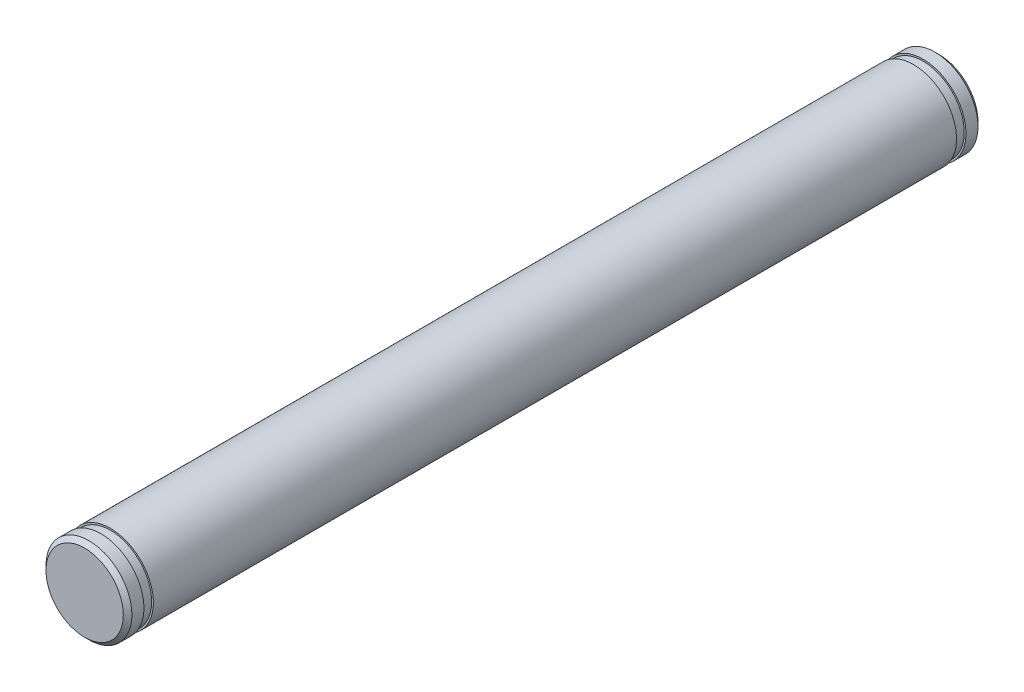
ISO-10303-21;
HEADER;
FILE_DESCRIPTION(('STEP AP214'),'2;1');
FILE_NAME('part.step','',(''),(''),'','','');
FILE_SCHEMA(('AUTOMOTIVE_DESIGN { 1 0 10303 214 1 1 1 1 }'));
ENDSEC;
DATA;
#1=APPLICATION_CONTEXT('core data for automotive mechanical design processes');
#2=APPLICATION_PROTOCOL_DEFINITION('international standard','automotive_design',2000,#1);
#3=PRODUCT_CONTEXT('',#1,'mechanical');
#4=PRODUCT('Part','Part','',(#3));
#5=PRODUCT_RELATED_PRODUCT_CATEGORY('part','',(#4));
#6=PRODUCT_DEFINITION_FORMATION('','',#4);
#7=PRODUCT_DEFINITION_CONTEXT('part definition',#1,'design');
#8=PRODUCT_DEFINITION('design','',#6,#7);
#9=PRODUCT_DEFINITION_SHAPE('','',#8);
#10=(LENGTH_UNIT() NAMED_UNIT(*) SI_UNIT(.MILLI.,.METRE.));
#11=(NAMED_UNIT(*) PLANE_ANGLE_UNIT() SI_UNIT($,.RADIAN.));
#12=(NAMED_UNIT(*) SI_UNIT($,.STERADIAN.) SOLID_ANGLE_UNIT());
#13=UNCERTAINTY_MEASURE_WITH_UNIT(LENGTH_MEASURE(1.E-05),#10,'distance_accuracy_value','');
#14=(GEOMETRIC_REPRESENTATION_CONTEXT(3) GLOBAL_UNCERTAINTY_ASSIGNED_CONTEXT((#13)) GLOBAL_UNIT_ASSIGNED_CONTEXT((#10,
#11,#12)) REPRESENTATION_CONTEXT('',''));
#15=CARTESIAN_POINT('',(0.,0.,0.));
#16=DIRECTION('',(0.,0.,1.));
#17=DIRECTION('',(1.,0.,0.));
#18=AXIS2_PLACEMENT_3D('',#15,#16,#17);
#19=CARTESIAN_POINT('',(0.,0.,99.5));
#20=DIRECTION('',(0.,0.,-1.));
#21=DIRECTION('',(-1.,0.,0.));
#22=AXIS2_PLACEMENT_3D('',#19,#20,#21);
#23=CYLINDRICAL_SURFACE('',#22,5.);
#24=CARTESIAN_POINT('',(0.,0.,3.));
#25=DIRECTION('',(0.,0.,-1.));
#26=DIRECTION('',(-1.,0.,0.));
#27=AXIS2_PLACEMENT_3D('',#24,#25,#26);
#28=CIRCLE('',#27,5.);
#29=CARTESIAN_POINT('',(-5.,0.,3.));
#30=VERTEX_POINT('',#29);
#31=EDGE_CURVE('E57',#30,#30,#28,.T.);
#32=ORIENTED_EDGE('',*,*,#31,.F.);
#33=EDGE_LOOP('',(#32));
#34=FACE_BOUND('',#33,.T.);
#35=CARTESIAN_POINT('',(0.,0.,96.5));
#36=DIRECTION('',(0.,0.,-1.));
#37=DIRECTION('',(-1.,0.,0.));
#38=AXIS2_PLACEMENT_3D('',#35,#36,#37);
#39=CIRCLE('',#38,5.);
#40=CARTESIAN_POINT('',(-5.,0.,96.5));
#41=VERTEX_POINT('',#40);
#42=EDGE_CURVE('E69',#41,#41,#39,.T.);
#43=ORIENTED_EDGE('',*,*,#42,.T.);
#44=EDGE_LOOP('',(#43));
#45=FACE_BOUND('',#44,.T.);
#46=ADVANCED_FACE('F35',(#34,#45),#23,.T.);
#47=CARTESIAN_POINT('',(0.,0.,1.9));
#48=DIRECTION('',(0.,0.,-1.));
#49=DIRECTION('',(-1.,0.,0.));
#50=AXIS2_PLACEMENT_3D('',#47,#48,#49);
#51=CIRCLE('',#50,5.);
#52=CARTESIAN_POINT('',(-5.,0.,1.9));
#53=VERTEX_POINT('',#52);
#54=EDGE_CURVE('E56',#53,#53,#51,.T.);
#55=ORIENTED_EDGE('',*,*,#54,.T.);
#56=EDGE_LOOP('',(#55));
#57=FACE_BOUND('',#56,.T.);
#58=CARTESIAN_POINT('',(0.,0.,0.500000000000014));
#59=DIRECTION('',(0.,0.,1.));
#60=DIRECTION('',(1.,0.,0.));
#61=AXIS2_PLACEMENT_3D('',#58,#59,#60);
#62=CIRCLE('',#61,5.);
#63=CARTESIAN_POINT('',(5.,0.,0.500000000000014));
#64=VERTEX_POINT('',#63);
#65=EDGE_CURVE('E47',#64,#64,#62,.T.);
#66=ORIENTED_EDGE('',*,*,#65,.T.);
#67=EDGE_LOOP('',(#66));
#68=FACE_BOUND('',#67,.T.);
#69=ADVANCED_FACE('F96',(#57,#68),#23,.T.);
#70=CARTESIAN_POINT('',(0.,0.,0.));
#71=DIRECTION('',(0.,0.,1.));
#72=DIRECTION('',(1.,0.,0.));
#73=AXIS2_PLACEMENT_3D('',#70,#71,#72);
#74=PLANE('',#73);
#75=CARTESIAN_POINT('',(0.,0.,0.));
#76=DIRECTION('',(0.,0.,1.));
#77=DIRECTION('',(1.,0.,0.));
#78=AXIS2_PLACEMENT_3D('',#75,#76,#77);
#79=CIRCLE('',#78,4.49999999999998);
#80=CARTESIAN_POINT('',(4.49999999999998,0.,0.));
#81=VERTEX_POINT('',#80);
#82=EDGE_CURVE('E10',#81,#81,#79,.F.);
#83=ORIENTED_EDGE('',*,*,#82,.T.);
#84=EDGE_LOOP('',(#83));
#85=FACE_BOUND('',#84,.T.);
#86=ADVANCED_FACE('F104',(#85),#74,.F.);
#87=CARTESIAN_POINT('',(0.,0.,0.500000000000014));
#88=DIRECTION('',(0.,0.,1.));
#89=DIRECTION('',(1.,0.,0.));
#90=AXIS2_PLACEMENT_3D('',#87,#88,#89);
#91=CONICAL_SURFACE('',#90,5.,0.785398163397458);
#92=ORIENTED_EDGE('',*,*,#82,.F.);
#93=EDGE_LOOP('',(#92));
#94=FACE_BOUND('',#93,.T.);
#95=ORIENTED_EDGE('',*,*,#65,.F.);
#96=EDGE_LOOP('',(#95));
#97=FACE_BOUND('',#96,.T.);
#98=ADVANCED_FACE('F38',(#94,#97),#91,.T.);
#99=CARTESIAN_POINT('',(0.,0.,1.9));
#100=DIRECTION('',(0.,0.,-1.));
#101=DIRECTION('',(-1.,0.,0.));
#102=AXIS2_PLACEMENT_3D('',#99,#100,#101);
#103=PLANE('',#102);
#104=ORIENTED_EDGE('',*,*,#54,.F.);
#105=EDGE_LOOP('',(#104));
#106=FACE_BOUND('',#105,.T.);
#107=CARTESIAN_POINT('',(0.,0.,1.9));
#108=DIRECTION('',(0.,0.,-1.));
#109=DIRECTION('',(-1.,0.,0.));
#110=AXIS2_PLACEMENT_3D('',#107,#108,#109);
#111=CIRCLE('',#110,4.8);
#112=CARTESIAN_POINT('',(-4.8,0.,1.9));
#113=VERTEX_POINT('',#112);
#114=EDGE_CURVE('E60',#113,#113,#111,.T.);
#115=ORIENTED_EDGE('',*,*,#114,.T.);
#116=EDGE_LOOP('',(#115));
#117=FACE_BOUND('',#116,.T.);
#118=ADVANCED_FACE('F126',(#106,#117),#103,.F.);
#119=CARTESIAN_POINT('',(0.,0.,3.));
#120=DIRECTION('',(0.,0.,-1.));
#121=DIRECTION('',(-1.,0.,0.));
#122=AXIS2_PLACEMENT_3D('',#119,#120,#121);
#123=PLANE('',#122);
#124=ORIENTED_EDGE('',*,*,#31,.T.);
#125=EDGE_LOOP('',(#124));
#126=FACE_BOUND('',#125,.T.);
#127=CARTESIAN_POINT('',(0.,0.,3.));
#128=DIRECTION('',(0.,0.,-1.));
#129=DIRECTION('',(-1.,0.,0.));
#130=AXIS2_PLACEMENT_3D('',#127,#128,#129);
#131=CIRCLE('',#130,4.8);
#132=CARTESIAN_POINT('',(-4.8,0.,3.));
#133=VERTEX_POINT('',#132);
#134=EDGE_CURVE('E63',#133,#133,#131,.T.);
#135=ORIENTED_EDGE('',*,*,#134,.F.);
#136=EDGE_LOOP('',(#135));
#137=FACE_BOUND('',#136,.T.);
#138=ADVANCED_FACE('F124',(#126,#137),#123,.T.);
#139=CARTESIAN_POINT('',(0.,0.,1.9));
#140=DIRECTION('',(0.,0.,1.));
#141=DIRECTION('',(1.,0.,0.));
#142=AXIS2_PLACEMENT_3D('',#139,#140,#141);
#143=CYLINDRICAL_SURFACE('',#142,4.8);
#144=ORIENTED_EDGE('',*,*,#114,.F.);
#145=EDGE_LOOP('',(#144));
#146=FACE_BOUND('',#145,.T.);
#147=ORIENTED_EDGE('',*,*,#134,.T.);
#148=EDGE_LOOP('',(#147));
#149=FACE_BOUND('',#148,.T.);
#150=ADVANCED_FACE('F88',(#146,#149),#143,.T.);
#151=CARTESIAN_POINT('',(0.,0.,97.6));
#152=DIRECTION('',(0.,0.,1.));
#153=DIRECTION('',(-1.,0.,0.));
#154=AXIS2_PLACEMENT_3D('',#151,#152,#153);
#155=PLANE('',#154);
#156=CARTESIAN_POINT('',(0.,0.,97.6));
#157=DIRECTION('',(0.,0.,-1.));
#158=DIRECTION('',(-1.,0.,0.));
#159=AXIS2_PLACEMENT_3D('',#156,#157,#158);
#160=CIRCLE('',#159,4.8);
#161=CARTESIAN_POINT('',(-4.8,0.,97.6));
#162=VERTEX_POINT('',#161);
#163=EDGE_CURVE('E72',#162,#162,#160,.T.);
#164=ORIENTED_EDGE('',*,*,#163,.F.);
#165=EDGE_LOOP('',(#164));
#166=FACE_BOUND('',#165,.T.);
#167=CARTESIAN_POINT('',(0.,0.,97.6));
#168=DIRECTION('',(0.,0.,-1.));
#169=DIRECTION('',(-1.,0.,0.));
#170=AXIS2_PLACEMENT_3D('',#167,#168,#169);
#171=CIRCLE('',#170,5.);
#172=CARTESIAN_POINT('',(-5.,0.,97.6));
#173=VERTEX_POINT('',#172);
#174=EDGE_CURVE('E66',#173,#173,#171,.T.);
#175=ORIENTED_EDGE('',*,*,#174,.T.);
#176=EDGE_LOOP('',(#175));
#177=FACE_BOUND('',#176,.T.);
#178=ADVANCED_FACE('F84',(#166,#177),#155,.F.);
#179=CARTESIAN_POINT('',(0.,0.,96.5));
#180=DIRECTION('',(0.,0.,1.));
#181=DIRECTION('',(-1.,0.,0.));
#182=AXIS2_PLACEMENT_3D('',#179,#180,#181);
#183=PLANE('',#182);
#184=CARTESIAN_POINT('',(0.,0.,96.5));
#185=DIRECTION('',(0.,0.,-1.));
#186=DIRECTION('',(-1.,0.,0.));
#187=AXIS2_PLACEMENT_3D('',#184,#185,#186);
#188=CIRCLE('',#187,4.8);
#189=CARTESIAN_POINT('',(-4.8,0.,96.5));
#190=VERTEX_POINT('',#189);
#191=EDGE_CURVE('E75',#190,#190,#188,.T.);
#192=ORIENTED_EDGE('',*,*,#191,.T.);
#193=EDGE_LOOP('',(#192));
#194=FACE_BOUND('',#193,.T.);
#195=ORIENTED_EDGE('',*,*,#42,.F.);
#196=EDGE_LOOP('',(#195));
#197=FACE_BOUND('',#196,.T.);
#198=ADVANCED_FACE('F87',(#194,#197),#183,.T.);
#199=CARTESIAN_POINT('',(0.,0.,97.6));
#200=DIRECTION('',(0.,0.,-1.));
#201=DIRECTION('',(-1.,0.,0.));
#202=AXIS2_PLACEMENT_3D('',#199,#200,#201);
#203=CYLINDRICAL_SURFACE('',#202,4.8);
#204=ORIENTED_EDGE('',*,*,#163,.T.);
#205=EDGE_LOOP('',(#204));
#206=FACE_BOUND('',#205,.T.);
#207=ORIENTED_EDGE('',*,*,#191,.F.);
#208=EDGE_LOOP('',(#207));
#209=FACE_BOUND('',#208,.T.);
#210=ADVANCED_FACE('F81',(#206,#209),#203,.T.);
#211=CARTESIAN_POINT('',(0.,0.,99.5));
#212=DIRECTION('',(0.,0.,1.));
#213=DIRECTION('',(1.,0.,0.));
#214=AXIS2_PLACEMENT_3D('',#211,#212,#213);
#215=PLANE('',#214);
#216=CARTESIAN_POINT('',(0.,0.,99.5));
#217=DIRECTION('',(0.,0.,1.));
#218=DIRECTION('',(1.,0.,0.));
#219=AXIS2_PLACEMENT_3D('',#216,#217,#218);
#220=CIRCLE('',#219,4.5);
#221=CARTESIAN_POINT('',(4.5,0.,99.5));
#222=VERTEX_POINT('',#221);
#223=EDGE_CURVE('E51',#222,#222,#220,.T.);
#224=ORIENTED_EDGE('',*,*,#223,.T.);
#225=EDGE_LOOP('',(#224));
#226=FACE_BOUND('',#225,.T.);
#227=ADVANCED_FACE('F100',(#226),#215,.T.);
#228=CARTESIAN_POINT('',(0.,0.,99.5));
#229=DIRECTION('',(0.,0.,-1.));
#230=DIRECTION('',(-1.,0.,0.));
#231=AXIS2_PLACEMENT_3D('',#228,#229,#230);
#232=CONICAL_SURFACE('',#231,4.5,0.785398163397444);
#233=CARTESIAN_POINT('',(0.,0.,99.));
#234=DIRECTION('',(0.,0.,1.));
#235=DIRECTION('',(1.,0.,0.));
#236=AXIS2_PLACEMENT_3D('',#233,#234,#235);
#237=CIRCLE('',#236,5.);
#238=CARTESIAN_POINT('',(5.,0.,99.));
#239=VERTEX_POINT('',#238);
#240=EDGE_CURVE('E43',#239,#239,#237,.F.);
#241=ORIENTED_EDGE('',*,*,#240,.F.);
#242=EDGE_LOOP('',(#241));
#243=FACE_BOUND('',#242,.T.);
#244=ORIENTED_EDGE('',*,*,#223,.F.);
#245=EDGE_LOOP('',(#244));
#246=FACE_BOUND('',#245,.T.);
#247=ADVANCED_FACE('F94',(#243,#246),#232,.T.);
#248=ORIENTED_EDGE('',*,*,#174,.F.);
#249=EDGE_LOOP('',(#248));
#250=FACE_BOUND('',#249,.T.);
#251=ORIENTED_EDGE('',*,*,#240,.T.);
#252=EDGE_LOOP('',(#251));
#253=FACE_BOUND('',#252,.T.);
#254=ADVANCED_FACE('F92',(#250,#253),#23,.T.);
#255=CLOSED_SHELL('',(#46,#69,#86,#98,#118,#138,#150,#178,#198,#210,#227,#247,#254));
#256=MANIFOLD_SOLID_BREP('B2',#255);
#257=ADVANCED_BREP_SHAPE_REPRESENTATION('',(#18,#256),#14);
#258=SHAPE_DEFINITION_REPRESENTATION(#9,#257);
ENDSEC;
END-ISO-10303-21;
